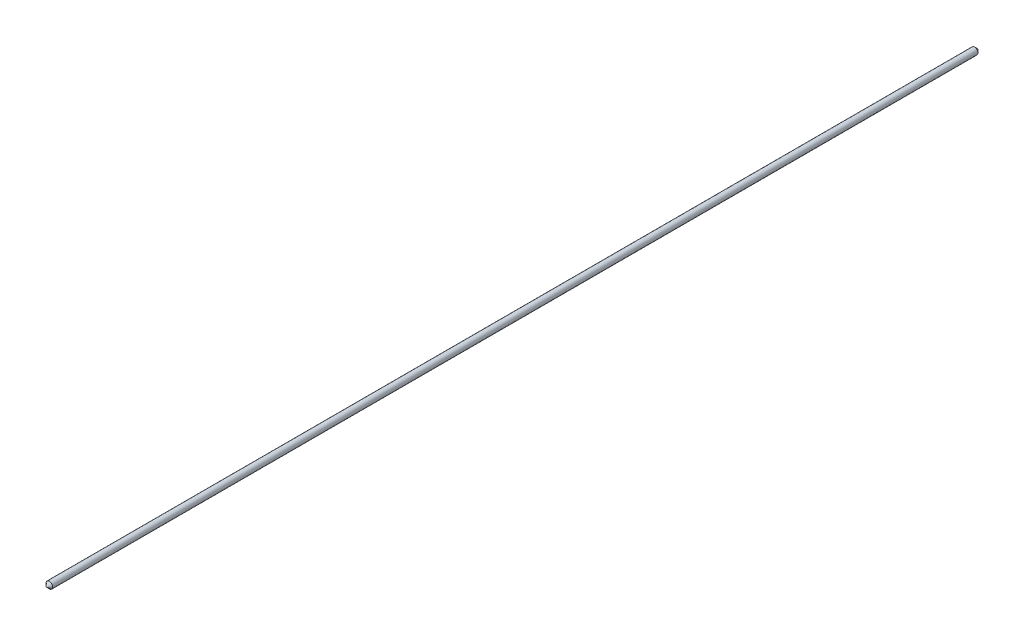
ISO-10303-21;
HEADER;
FILE_DESCRIPTION(('STEP AP214'),'2;1');
FILE_NAME('part.step','',(''),(''),'','','');
FILE_SCHEMA(('AUTOMOTIVE_DESIGN { 1 0 10303 214 1 1 1 1 }'));
ENDSEC;
DATA;
#1=APPLICATION_CONTEXT('core data for automotive mechanical design processes');
#2=APPLICATION_PROTOCOL_DEFINITION('international standard','automotive_design',2000,#1);
#3=PRODUCT_CONTEXT('',#1,'mechanical');
#4=PRODUCT('Part','Part','',(#3));
#5=PRODUCT_RELATED_PRODUCT_CATEGORY('part','',(#4));
#6=PRODUCT_DEFINITION_FORMATION('','',#4);
#7=PRODUCT_DEFINITION_CONTEXT('part definition',#1,'design');
#8=PRODUCT_DEFINITION('design','',#6,#7);
#9=PRODUCT_DEFINITION_SHAPE('','',#8);
#10=(LENGTH_UNIT() NAMED_UNIT(*) SI_UNIT(.MILLI.,.METRE.));
#11=(NAMED_UNIT(*) PLANE_ANGLE_UNIT() SI_UNIT($,.RADIAN.));
#12=(NAMED_UNIT(*) SI_UNIT($,.STERADIAN.) SOLID_ANGLE_UNIT());
#13=UNCERTAINTY_MEASURE_WITH_UNIT(LENGTH_MEASURE(1.E-05),#10,'distance_accuracy_value','');
#14=(GEOMETRIC_REPRESENTATION_CONTEXT(3) GLOBAL_UNCERTAINTY_ASSIGNED_CONTEXT((#13)) GLOBAL_UNIT_ASSIGNED_CONTEXT((#10,
#11,#12)) REPRESENTATION_CONTEXT('',''));
#15=CARTESIAN_POINT('',(0.,0.,0.));
#16=DIRECTION('',(0.,0.,1.));
#17=DIRECTION('',(1.,0.,0.));
#18=AXIS2_PLACEMENT_3D('',#15,#16,#17);
#19=CARTESIAN_POINT('',(0.,0.,22.6668811256365));
#20=DIRECTION('',(0.,0.,-1.));
#21=DIRECTION('',(0.,1.,0.));
#22=AXIS2_PLACEMENT_3D('',#19,#20,#21);
#23=CONICAL_SURFACE('',#22,10.,0.800582527889787);
#24=CARTESIAN_POINT('',(0.,0.,32.3677135129916));
#25=VERTEX_POINT('',#24);
#26=VERTEX_LOOP('',#25);
#27=FACE_BOUND('',#26,.T.);
#28=CARTESIAN_POINT('',(0.,0.,22.6668811256365));
#29=DIRECTION('',(0.,0.,1.));
#30=DIRECTION('',(0.,-1.,0.));
#31=AXIS2_PLACEMENT_3D('',#28,#29,#30);
#32=CIRCLE('',#31,10.);
#33=CARTESIAN_POINT('',(0.,-10.,22.6668811256365));
#34=VERTEX_POINT('',#33);
#35=EDGE_CURVE('E43',#34,#34,#32,.T.);
#36=ORIENTED_EDGE('',*,*,#35,.T.);
#37=EDGE_LOOP('',(#36));
#38=FACE_BOUND('',#37,.T.);
#39=ADVANCED_FACE('F36',(#27,#38),#23,.T.);
#40=CARTESIAN_POINT('',(0.,0.,-2753.95228648701));
#41=DIRECTION('',(0.,0.,1.));
#42=DIRECTION('',(0.,-1.,0.));
#43=AXIS2_PLACEMENT_3D('',#40,#41,#42);
#44=CONICAL_SURFACE('',#43,0.,0.770039265979883);
#45=CARTESIAN_POINT('',(0.,0.,-2743.64029211602));
#46=DIRECTION('',(0.,0.,1.));
#47=DIRECTION('',(0.,-1.,0.));
#48=AXIS2_PLACEMENT_3D('',#45,#46,#47);
#49=CIRCLE('',#48,10.);
#50=CARTESIAN_POINT('',(0.,-10.,-2743.64029211602));
#51=VERTEX_POINT('',#50);
#52=EDGE_CURVE('E11',#51,#51,#49,.T.);
#53=ORIENTED_EDGE('',*,*,#52,.F.);
#54=EDGE_LOOP('',(#53));
#55=FACE_BOUND('',#54,.T.);
#56=CARTESIAN_POINT('',(0.,0.,-2753.95228648701));
#57=VERTEX_POINT('',#56);
#58=VERTEX_LOOP('',#57);
#59=FACE_BOUND('',#58,.T.);
#60=ADVANCED_FACE('F49',(#55,#59),#44,.T.);
#61=CARTESIAN_POINT('',(0.,0.,32.3677135129916));
#62=DIRECTION('',(0.,0.,1.));
#63=DIRECTION('',(0.,-1.,0.));
#64=AXIS2_PLACEMENT_3D('',#61,#62,#63);
#65=CYLINDRICAL_SURFACE('',#64,10.);
#66=ORIENTED_EDGE('',*,*,#35,.F.);
#67=EDGE_LOOP('',(#66));
#68=FACE_BOUND('',#67,.T.);
#69=ORIENTED_EDGE('',*,*,#52,.T.);
#70=EDGE_LOOP('',(#69));
#71=FACE_BOUND('',#70,.T.);
#72=ADVANCED_FACE('F51',(#68,#71),#65,.T.);
#73=CLOSED_SHELL('',(#39,#60,#72));
#74=MANIFOLD_SOLID_BREP('B2',#73);
#75=ADVANCED_BREP_SHAPE_REPRESENTATION('',(#18,#74),#14);
#76=SHAPE_DEFINITION_REPRESENTATION(#9,#75);
ENDSEC;
END-ISO-10303-21;
